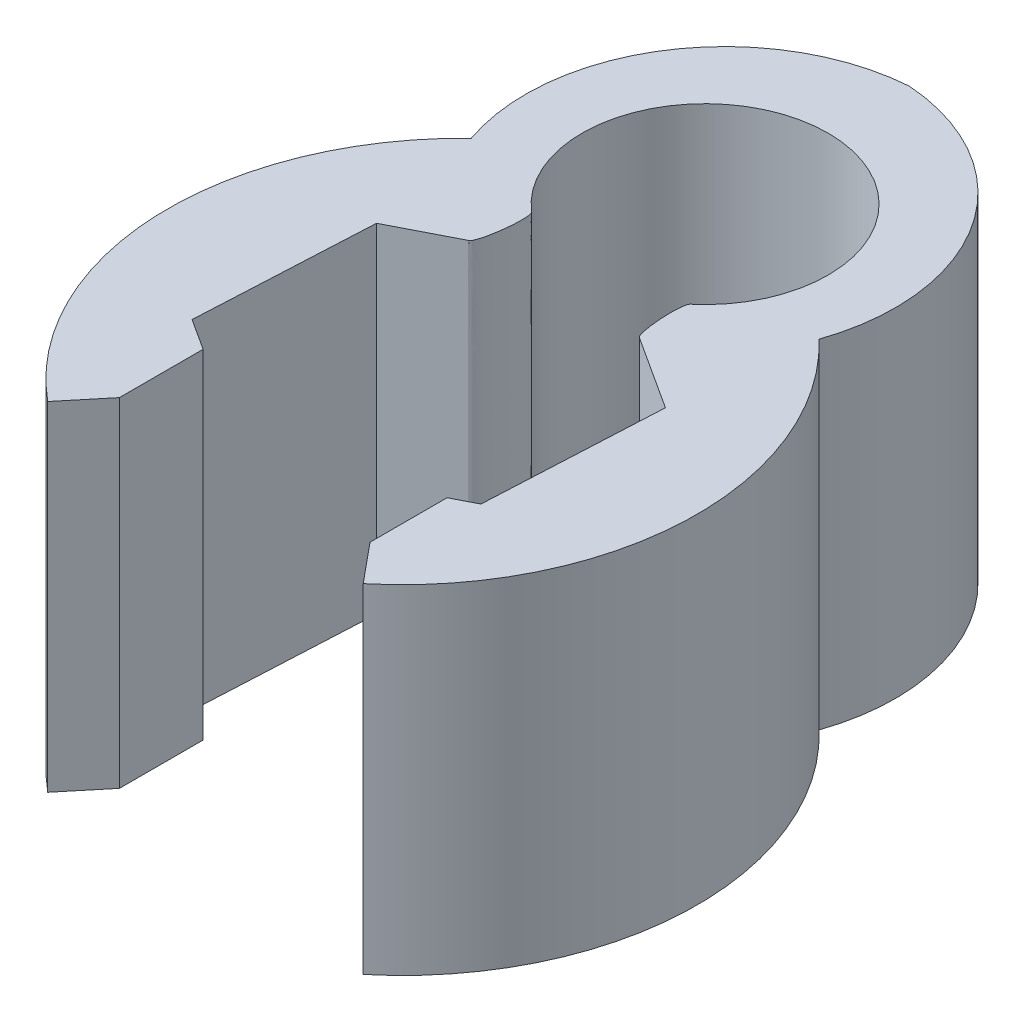
ISO-10303-21;
HEADER;
FILE_DESCRIPTION(('STEP AP214'),'2;1');
FILE_NAME('part.step','',(''),(''),'','','');
FILE_SCHEMA(('AUTOMOTIVE_DESIGN { 1 0 10303 214 1 1 1 1 }'));
ENDSEC;
DATA;
#1=APPLICATION_CONTEXT('core data for automotive mechanical design processes');
#2=APPLICATION_PROTOCOL_DEFINITION('international standard','automotive_design',2000,#1);
#3=PRODUCT_CONTEXT('',#1,'mechanical');
#4=PRODUCT('Part','Part','',(#3));
#5=PRODUCT_RELATED_PRODUCT_CATEGORY('part','',(#4));
#6=PRODUCT_DEFINITION_FORMATION('','',#4);
#7=PRODUCT_DEFINITION_CONTEXT('part definition',#1,'design');
#8=PRODUCT_DEFINITION('design','',#6,#7);
#9=PRODUCT_DEFINITION_SHAPE('','',#8);
#10=(LENGTH_UNIT() NAMED_UNIT(*) SI_UNIT(.MILLI.,.METRE.));
#11=(NAMED_UNIT(*) PLANE_ANGLE_UNIT() SI_UNIT($,.RADIAN.));
#12=(NAMED_UNIT(*) SI_UNIT($,.STERADIAN.) SOLID_ANGLE_UNIT());
#13=UNCERTAINTY_MEASURE_WITH_UNIT(LENGTH_MEASURE(1.E-05),#10,'distance_accuracy_value','');
#14=(GEOMETRIC_REPRESENTATION_CONTEXT(3) GLOBAL_UNCERTAINTY_ASSIGNED_CONTEXT((#13)) GLOBAL_UNIT_ASSIGNED_CONTEXT((#10,
#11,#12)) REPRESENTATION_CONTEXT('',''));
#15=CARTESIAN_POINT('',(0.,0.,0.));
#16=DIRECTION('',(0.,0.,1.));
#17=DIRECTION('',(1.,0.,0.));
#18=AXIS2_PLACEMENT_3D('',#15,#16,#17);
#19=CARTESIAN_POINT('',(-0.598376770378096,12.7,0.494644047014797));
#20=DIRECTION('',(0.770751226655631,0.,-0.637136207265636));
#21=DIRECTION('',(-0.637136207265636,0.,-0.770751226655631));
#22=AXIS2_PLACEMENT_3D('',#19,#20,#21);
#23=PLANE('',#22);
#24=DIRECTION('',(0.637136207265636,0.,0.770751226655631));
#25=VECTOR('',#24,1.);
#26=CARTESIAN_POINT('',(-0.598376770378096,0.,0.494644047014797));
#27=LINE('',#26,#25);
#28=CARTESIAN_POINT('',(4.70120496832042,0.,6.90561093177807));
#29=VERTEX_POINT('',#28);
#30=CARTESIAN_POINT('',(5.9187802535043,0.,8.37852619526394));
#31=VERTEX_POINT('',#30);
#32=EDGE_CURVE('E196',#29,#31,#27,.T.);
#33=ORIENTED_EDGE('',*,*,#32,.T.);
#34=DIRECTION('',(0.,-1.,0.));
#35=VECTOR('',#34,1.);
#36=CARTESIAN_POINT('',(5.9187802535043,12.7,8.37852619526394));
#37=LINE('',#36,#35);
#38=CARTESIAN_POINT('',(5.9187802535043,12.7,8.37852619526394));
#39=VERTEX_POINT('',#38);
#40=EDGE_CURVE('E177',#39,#31,#37,.T.);
#41=ORIENTED_EDGE('',*,*,#40,.F.);
#42=DIRECTION('',(0.637136207265636,0.,0.770751226655631));
#43=VECTOR('',#42,1.);
#44=CARTESIAN_POINT('',(-0.598376770378096,12.7,0.494644047014797));
#45=LINE('',#44,#43);
#46=CARTESIAN_POINT('',(4.70120496832042,12.7,6.90561093177807));
#47=VERTEX_POINT('',#46);
#48=EDGE_CURVE('E183',#47,#39,#45,.T.);
#49=ORIENTED_EDGE('',*,*,#48,.F.);
#50=DIRECTION('',(0.,-1.,0.));
#51=VECTOR('',#50,1.);
#52=CARTESIAN_POINT('',(4.70120496832042,12.7,6.90561093177807));
#53=LINE('',#52,#51);
#54=EDGE_CURVE('E225',#47,#29,#53,.T.);
#55=ORIENTED_EDGE('',*,*,#54,.T.);
#56=EDGE_LOOP('',(#33,#41,#49,#55));
#57=FACE_BOUND('',#56,.T.);
#58=ADVANCED_FACE('F46',(#57),#23,.F.);
#59=CARTESIAN_POINT('',(-1.12456517035275,12.7,-0.141892301269298));
#60=DIRECTION('',(0.,-1.,0.));
#61=DIRECTION('',(0.,0.,-1.));
#62=AXIS2_PLACEMENT_3D('',#59,#60,#61);
#63=CYLINDRICAL_SURFACE('',#62,11.0546933976404);
#64=CARTESIAN_POINT('',(-1.12456517035275,0.,-0.141892301269298));
#65=DIRECTION('',(0.,1.,0.));
#66=DIRECTION('',(0.,0.,1.));
#67=AXIS2_PLACEMENT_3D('',#64,#65,#66);
#68=CIRCLE('',#67,11.0546933976404);
#69=CARTESIAN_POINT('',(6.52662469768185,0.,-8.12096115165017));
#70=VERTEX_POINT('',#69);
#71=EDGE_CURVE('E261',#31,#70,#68,.T.);
#72=ORIENTED_EDGE('',*,*,#71,.T.);
#73=DIRECTION('',(0.,-1.,0.));
#74=VECTOR('',#73,1.);
#75=CARTESIAN_POINT('',(6.52662469768185,12.7,-8.12096115165017));
#76=LINE('',#75,#74);
#77=CARTESIAN_POINT('',(6.52662469768185,12.7,-8.12096115165017));
#78=VERTEX_POINT('',#77);
#79=EDGE_CURVE('E180',#78,#70,#76,.T.);
#80=ORIENTED_EDGE('',*,*,#79,.F.);
#81=CARTESIAN_POINT('',(-1.12456517035275,12.7,-0.141892301269298));
#82=DIRECTION('',(0.,1.,0.));
#83=DIRECTION('',(0.,0.,1.));
#84=AXIS2_PLACEMENT_3D('',#81,#82,#83);
#85=CIRCLE('',#84,11.0546933976404);
#86=EDGE_CURVE('E173',#39,#78,#85,.T.);
#87=ORIENTED_EDGE('',*,*,#86,.F.);
#88=ORIENTED_EDGE('',*,*,#40,.T.);
#89=EDGE_LOOP('',(#72,#80,#87,#88));
#90=FACE_BOUND('',#89,.T.);
#91=ADVANCED_FACE('F175',(#90),#63,.T.);
#92=CARTESIAN_POINT('',(-0.542547571953858,12.7,-10.5725213353697));
#93=DIRECTION('',(0.,-1.,0.));
#94=DIRECTION('',(0.,0.,-1.));
#95=AXIS2_PLACEMENT_3D('',#92,#93,#94);
#96=CYLINDRICAL_SURFACE('',#95,7.48220180910577);
#97=CARTESIAN_POINT('',(-0.542547571953858,0.,-10.5725213353697));
#98=DIRECTION('',(0.,1.,0.));
#99=DIRECTION('',(0.,0.,1.));
#100=AXIS2_PLACEMENT_3D('',#97,#98,#99);
#101=CIRCLE('',#100,7.48220180910577);
#102=CARTESIAN_POINT('',(0.,0.,-18.0350266817231));
#103=VERTEX_POINT('',#102);
#104=EDGE_CURVE('E258',#70,#103,#101,.T.);
#105=ORIENTED_EDGE('',*,*,#104,.T.);
#106=DIRECTION('',(0.,-1.,0.));
#107=VECTOR('',#106,1.);
#108=CARTESIAN_POINT('',(0.,12.7,-18.0350266817231));
#109=LINE('',#108,#107);
#110=CARTESIAN_POINT('',(0.,12.7,-18.0350266817231));
#111=VERTEX_POINT('',#110);
#112=EDGE_CURVE('E201',#111,#103,#109,.T.);
#113=ORIENTED_EDGE('',*,*,#112,.F.);
#114=CARTESIAN_POINT('',(-0.542547571953858,12.7,-10.5725213353697));
#115=DIRECTION('',(0.,1.,0.));
#116=DIRECTION('',(0.,0.,1.));
#117=AXIS2_PLACEMENT_3D('',#114,#115,#116);
#118=CIRCLE('',#117,7.48220180910577);
#119=EDGE_CURVE('E182',#78,#111,#118,.T.);
#120=ORIENTED_EDGE('',*,*,#119,.F.);
#121=ORIENTED_EDGE('',*,*,#79,.T.);
#122=EDGE_LOOP('',(#105,#113,#120,#121));
#123=FACE_BOUND('',#122,.T.);
#124=ADVANCED_FACE('F259',(#123),#96,.T.);
#125=CARTESIAN_POINT('',(0.542547571953858,12.7,-10.5725213353697));
#126=DIRECTION('',(0.,-1.,0.));
#127=DIRECTION('',(0.,0.,-1.));
#128=AXIS2_PLACEMENT_3D('',#125,#126,#127);
#129=CYLINDRICAL_SURFACE('',#128,7.48220180910577);
#130=CARTESIAN_POINT('',(0.542547571953858,0.,-10.5725213353697));
#131=DIRECTION('',(0.,1.,0.));
#132=DIRECTION('',(0.,0.,1.));
#133=AXIS2_PLACEMENT_3D('',#130,#131,#132);
#134=CIRCLE('',#133,7.48220180910577);
#135=CARTESIAN_POINT('',(-6.52662469768186,0.,-8.12096115165017));
#136=VERTEX_POINT('',#135);
#137=EDGE_CURVE('E252',#136,#103,#134,.F.);
#138=ORIENTED_EDGE('',*,*,#137,.F.);
#139=DIRECTION('',(0.,-1.,0.));
#140=VECTOR('',#139,1.);
#141=CARTESIAN_POINT('',(-6.52662469768186,12.7,-8.12096115165017));
#142=LINE('',#141,#140);
#143=CARTESIAN_POINT('',(-6.52662469768186,12.7,-8.12096115165017));
#144=VERTEX_POINT('',#143);
#145=EDGE_CURVE('E244',#144,#136,#142,.T.);
#146=ORIENTED_EDGE('',*,*,#145,.F.);
#147=CARTESIAN_POINT('',(0.542547571953858,12.7,-10.5725213353697));
#148=DIRECTION('',(0.,1.,0.));
#149=DIRECTION('',(0.,0.,1.));
#150=AXIS2_PLACEMENT_3D('',#147,#148,#149);
#151=CIRCLE('',#150,7.48220180910577);
#152=EDGE_CURVE('E255',#144,#111,#151,.F.);
#153=ORIENTED_EDGE('',*,*,#152,.T.);
#154=ORIENTED_EDGE('',*,*,#112,.T.);
#155=EDGE_LOOP('',(#138,#146,#153,#154));
#156=FACE_BOUND('',#155,.T.);
#157=ADVANCED_FACE('F250',(#156),#129,.T.);
#158=CARTESIAN_POINT('',(1.12456517035275,12.7,-0.141892301269298));
#159=DIRECTION('',(0.,-1.,0.));
#160=DIRECTION('',(0.,0.,-1.));
#161=AXIS2_PLACEMENT_3D('',#158,#159,#160);
#162=CYLINDRICAL_SURFACE('',#161,11.0546933976404);
#163=CARTESIAN_POINT('',(1.12456517035275,0.,-0.141892301269298));
#164=DIRECTION('',(0.,1.,0.));
#165=DIRECTION('',(0.,0.,1.));
#166=AXIS2_PLACEMENT_3D('',#163,#164,#165);
#167=CIRCLE('',#166,11.0546933976404);
#168=CARTESIAN_POINT('',(-5.91878025350429,0.,8.37852619526395));
#169=VERTEX_POINT('',#168);
#170=EDGE_CURVE('E266',#169,#136,#167,.F.);
#171=ORIENTED_EDGE('',*,*,#170,.F.);
#172=DIRECTION('',(0.,-1.,0.));
#173=VECTOR('',#172,1.);
#174=CARTESIAN_POINT('',(-5.91878025350429,12.7,8.37852619526395));
#175=LINE('',#174,#173);
#176=CARTESIAN_POINT('',(-5.91878025350429,12.7,8.37852619526395));
#177=VERTEX_POINT('',#176);
#178=EDGE_CURVE('E242',#177,#169,#175,.T.);
#179=ORIENTED_EDGE('',*,*,#178,.F.);
#180=CARTESIAN_POINT('',(1.12456517035275,12.7,-0.141892301269298));
#181=DIRECTION('',(0.,1.,0.));
#182=DIRECTION('',(0.,0.,1.));
#183=AXIS2_PLACEMENT_3D('',#180,#181,#182);
#184=CIRCLE('',#183,11.0546933976404);
#185=EDGE_CURVE('E546',#177,#144,#184,.F.);
#186=ORIENTED_EDGE('',*,*,#185,.T.);
#187=ORIENTED_EDGE('',*,*,#145,.T.);
#188=EDGE_LOOP('',(#171,#179,#186,#187));
#189=FACE_BOUND('',#188,.T.);
#190=ADVANCED_FACE('F507',(#189),#162,.T.);
#191=CARTESIAN_POINT('',(0.598376770378092,12.7,0.494644047014792));
#192=DIRECTION('',(0.770751226655632,0.,0.637136207265635));
#193=DIRECTION('',(0.637136207265635,0.,-0.770751226655632));
#194=AXIS2_PLACEMENT_3D('',#191,#192,#193);
#195=PLANE('',#194);
#196=DIRECTION('',(-0.637136207265635,0.,0.770751226655632));
#197=VECTOR('',#196,1.);
#198=CARTESIAN_POINT('',(0.598376770378092,0.,0.494644047014792));
#199=LINE('',#198,#197);
#200=CARTESIAN_POINT('',(-4.70120496832041,0.,6.90561093177807));
#201=VERTEX_POINT('',#200);
#202=EDGE_CURVE('E268',#201,#169,#199,.T.);
#203=ORIENTED_EDGE('',*,*,#202,.F.);
#204=DIRECTION('',(0.,-1.,0.));
#205=VECTOR('',#204,1.);
#206=CARTESIAN_POINT('',(-4.70120496832041,12.7,6.90561093177807));
#207=LINE('',#206,#205);
#208=CARTESIAN_POINT('',(-4.70120496832041,12.7,6.90561093177807));
#209=VERTEX_POINT('',#208);
#210=EDGE_CURVE('E240',#209,#201,#207,.T.);
#211=ORIENTED_EDGE('',*,*,#210,.F.);
#212=DIRECTION('',(-0.637136207265635,0.,0.770751226655632));
#213=VECTOR('',#212,1.);
#214=CARTESIAN_POINT('',(0.598376770378092,12.7,0.494644047014792));
#215=LINE('',#214,#213);
#216=EDGE_CURVE('E543',#209,#177,#215,.T.);
#217=ORIENTED_EDGE('',*,*,#216,.T.);
#218=ORIENTED_EDGE('',*,*,#178,.T.);
#219=EDGE_LOOP('',(#203,#211,#217,#218));
#220=FACE_BOUND('',#219,.T.);
#221=ADVANCED_FACE('F510',(#220),#195,.T.);
#222=CARTESIAN_POINT('',(-4.70120496832042,12.7,0.));
#223=DIRECTION('',(1.,0.,0.));
#224=DIRECTION('',(0.,0.,-1.));
#225=AXIS2_PLACEMENT_3D('',#222,#223,#224);
#226=PLANE('',#225);
#227=DIRECTION('',(0.,0.,1.));
#228=VECTOR('',#227,1.);
#229=CARTESIAN_POINT('',(-4.70120496832042,0.,0.));
#230=LINE('',#229,#228);
#231=CARTESIAN_POINT('',(-4.70120496832042,0.,3.76579802688678));
#232=VERTEX_POINT('',#231);
#233=EDGE_CURVE('E273',#232,#201,#230,.T.);
#234=ORIENTED_EDGE('',*,*,#233,.F.);
#235=DIRECTION('',(0.,-1.,0.));
#236=VECTOR('',#235,1.);
#237=CARTESIAN_POINT('',(-4.70120496832042,12.7,3.76579802688678));
#238=LINE('',#237,#236);
#239=CARTESIAN_POINT('',(-4.70120496832042,12.7,3.76579802688678));
#240=VERTEX_POINT('',#239);
#241=EDGE_CURVE('E238',#240,#232,#238,.T.);
#242=ORIENTED_EDGE('',*,*,#241,.F.);
#243=DIRECTION('',(0.,0.,1.));
#244=VECTOR('',#243,1.);
#245=CARTESIAN_POINT('',(-4.70120496832042,12.7,0.));
#246=LINE('',#245,#244);
#247=EDGE_CURVE('E538',#240,#209,#246,.T.);
#248=ORIENTED_EDGE('',*,*,#247,.T.);
#249=ORIENTED_EDGE('',*,*,#210,.T.);
#250=EDGE_LOOP('',(#234,#242,#248,#249));
#251=FACE_BOUND('',#250,.T.);
#252=ADVANCED_FACE('F514',(#251),#226,.T.);
#253=CARTESIAN_POINT('',(-3.10319954031292,12.7,4.7991017506406));
#254=DIRECTION('',(0.542992045549067,0.,-0.839737839132214));
#255=DIRECTION('',(-0.839737839132214,0.,-0.542992045549067));
#256=AXIS2_PLACEMENT_3D('',#253,#254,#255);
#257=PLANE('',#256);
#258=DIRECTION('',(0.839737839132214,0.,0.542992045549067));
#259=VECTOR('',#258,1.);
#260=CARTESIAN_POINT('',(-3.10319954031292,0.,4.7991017506406));
#261=LINE('',#260,#259);
#262=CARTESIAN_POINT('',(-5.87396222791367,0.,3.00746866069182));
#263=VERTEX_POINT('',#262);
#264=EDGE_CURVE('E276',#263,#232,#261,.T.);
#265=ORIENTED_EDGE('',*,*,#264,.F.);
#266=DIRECTION('',(0.,-1.,0.));
#267=VECTOR('',#266,1.);
#268=CARTESIAN_POINT('',(-5.87396222791367,12.7,3.00746866069182));
#269=LINE('',#268,#267);
#270=CARTESIAN_POINT('',(-5.87396222791367,12.7,3.00746866069182));
#271=VERTEX_POINT('',#270);
#272=EDGE_CURVE('E236',#271,#263,#269,.T.);
#273=ORIENTED_EDGE('',*,*,#272,.F.);
#274=DIRECTION('',(0.839737839132214,0.,0.542992045549067));
#275=VECTOR('',#274,1.);
#276=CARTESIAN_POINT('',(-3.10319954031292,12.7,4.7991017506406));
#277=LINE('',#276,#275);
#278=EDGE_CURVE('E537',#271,#240,#277,.T.);
#279=ORIENTED_EDGE('',*,*,#278,.T.);
#280=ORIENTED_EDGE('',*,*,#241,.T.);
#281=EDGE_LOOP('',(#265,#273,#279,#280));
#282=FACE_BOUND('',#281,.T.);
#283=ADVANCED_FACE('F518',(#282),#257,.T.);
#284=CARTESIAN_POINT('',(-5.70774380155759,12.7,-0.287898759602873));
#285=DIRECTION('',(0.998730323982081,0.,0.0503759859322613));
#286=DIRECTION('',(0.0503759859322613,0.,-0.998730323982081));
#287=AXIS2_PLACEMENT_3D('',#284,#285,#286);
#288=PLANE('',#287);
#289=DIRECTION('',(-0.0503759859322613,0.,0.998730323982081));
#290=VECTOR('',#289,1.);
#291=CARTESIAN_POINT('',(-5.70774380155759,0.,-0.287898759602873));
#292=LINE('',#291,#290);
#293=CARTESIAN_POINT('',(-5.54152537520151,0.,-3.58326617989757));
#294=VERTEX_POINT('',#293);
#295=EDGE_CURVE('E279',#294,#263,#292,.T.);
#296=ORIENTED_EDGE('',*,*,#295,.F.);
#297=DIRECTION('',(0.,-1.,0.));
#298=VECTOR('',#297,1.);
#299=CARTESIAN_POINT('',(-5.54152537520151,12.7,-3.58326617989757));
#300=LINE('',#299,#298);
#301=CARTESIAN_POINT('',(-5.54152537520151,12.7,-3.58326617989757));
#302=VERTEX_POINT('',#301);
#303=EDGE_CURVE('E233',#302,#294,#300,.T.);
#304=ORIENTED_EDGE('',*,*,#303,.F.);
#305=DIRECTION('',(-0.0503759859322613,0.,0.998730323982081));
#306=VECTOR('',#305,1.);
#307=CARTESIAN_POINT('',(-5.70774380155759,12.7,-0.287898759602873));
#308=LINE('',#307,#306);
#309=EDGE_CURVE('E388',#302,#271,#308,.T.);
#310=ORIENTED_EDGE('',*,*,#309,.T.);
#311=ORIENTED_EDGE('',*,*,#272,.T.);
#312=EDGE_LOOP('',(#296,#304,#310,#311));
#313=FACE_BOUND('',#312,.T.);
#314=ADVANCED_FACE('F521',(#313),#288,.T.);
#315=CARTESIAN_POINT('',(-2.60454426124468,12.7,-5.08700051024348));
#316=DIRECTION('',(0.455738278433015,0.,0.890113825064476));
#317=DIRECTION('',(0.890113825064476,0.,-0.455738278433015));
#318=AXIS2_PLACEMENT_3D('',#315,#316,#317);
#319=PLANE('',#318);
#320=DIRECTION('',(-0.890113825064476,0.,0.455738278433015));
#321=VECTOR('',#320,1.);
#322=CARTESIAN_POINT('',(-2.60454426124468,0.,-5.08700051024348));
#323=LINE('',#322,#321);
#324=CARTESIAN_POINT('',(-3.24270927997033,0.,-4.76026002065594));
#325=VERTEX_POINT('',#324);
#326=EDGE_CURVE('E281',#325,#294,#323,.T.);
#327=ORIENTED_EDGE('',*,*,#326,.F.);
#328=CARTESIAN_POINT('',(-3.24270927997033,13.335,-4.76026002065594));
#329=CARTESIAN_POINT('',(-3.24270927997033,8.67833333333333,-4.76026002065594));
#330=CARTESIAN_POINT('',(-3.24270927997033,4.02166666666667,-4.76026002065594));
#331=CARTESIAN_POINT('',(-3.24270927997033,-0.634999999999998,-4.76026002065594));
#332=(BOUNDED_CURVE() B_SPLINE_CURVE(3,(#328,#329,#330,#331),.UNSPECIFIED.,.F.,
.F.) B_SPLINE_CURVE_WITH_KNOTS((4,4),(-0.000635,0.013335),
.UNSPECIFIED.) CURVE() GEOMETRIC_REPRESENTATION_ITEM() RATIONAL_B_SPLINE_CURVE((1.,1.,1.,1.)) REPRESENTATION_ITEM(''));
#333=CARTESIAN_POINT('',(-3.24270927997033,12.7,-4.76026002065594));
#334=VERTEX_POINT('',#333);
#335=EDGE_CURVE('E12',#325,#334,#332,.F.);
#336=ORIENTED_EDGE('',*,*,#335,.T.);
#337=DIRECTION('',(-0.890113825064476,0.,0.455738278433015));
#338=VECTOR('',#337,1.);
#339=CARTESIAN_POINT('',(-2.60454426124468,12.7,-5.08700051024348));
#340=LINE('',#339,#338);
#341=EDGE_CURVE('E319',#334,#302,#340,.T.);
#342=ORIENTED_EDGE('',*,*,#341,.T.);
#343=ORIENTED_EDGE('',*,*,#303,.T.);
#344=EDGE_LOOP('',(#327,#336,#342,#343));
#345=FACE_BOUND('',#344,.T.);
#346=ADVANCED_FACE('F371',(#345),#319,.T.);
#347=CARTESIAN_POINT('',(0.,12.7,-10.3692276538807));
#348=DIRECTION('',(0.,-1.,0.));
#349=DIRECTION('',(0.,0.,-1.));
#350=AXIS2_PLACEMENT_3D('',#347,#348,#349);
#351=CYLINDRICAL_SURFACE('',#350,4.61735997238747);
#352=CARTESIAN_POINT('',(0.,0.,-10.3692276538807));
#353=DIRECTION('',(0.,1.,0.));
#354=DIRECTION('',(0.,0.,1.));
#355=AXIS2_PLACEMENT_3D('',#352,#353,#354);
#356=CIRCLE('',#355,4.61735997238747);
#357=CARTESIAN_POINT('',(2.97420564902517,0.,-6.83735649656018));
#358=VERTEX_POINT('',#357);
#359=CARTESIAN_POINT('',(-2.99713740518316,0.,-6.85679537851113));
#360=VERTEX_POINT('',#359);
#361=EDGE_CURVE('E210',#358,#360,#356,.T.);
#362=ORIENTED_EDGE('',*,*,#361,.F.);
#363=CARTESIAN_POINT('',(2.97420564902517,13.335,-6.83735649656018));
#364=CARTESIAN_POINT('',(2.97420564902517,8.67833333333333,-6.83735649656018));
#365=CARTESIAN_POINT('',(2.97420564902517,4.02166666666667,-6.83735649656018));
#366=CARTESIAN_POINT('',(2.97420564902517,-0.634999999999998,-6.83735649656018));
#367=(BOUNDED_CURVE() B_SPLINE_CURVE(3,(#363,#364,#365,#366),.UNSPECIFIED.,.F.,
.F.) B_SPLINE_CURVE_WITH_KNOTS((4,4),(-0.000635,0.013335),
.UNSPECIFIED.) CURVE() GEOMETRIC_REPRESENTATION_ITEM() RATIONAL_B_SPLINE_CURVE((1.,1.,1.,1.)) REPRESENTATION_ITEM(''));
#368=CARTESIAN_POINT('',(2.97420564902517,12.7,-6.83735649656018));
#369=VERTEX_POINT('',#368);
#370=EDGE_CURVE('E455',#358,#369,#367,.F.);
#371=ORIENTED_EDGE('',*,*,#370,.T.);
#372=CARTESIAN_POINT('',(0.,12.7,-10.3692276538807));
#373=DIRECTION('',(0.,1.,0.));
#374=DIRECTION('',(0.,0.,1.));
#375=AXIS2_PLACEMENT_3D('',#372,#373,#374);
#376=CIRCLE('',#375,4.61735997238747);
#377=CARTESIAN_POINT('',(-2.99713740518315,12.7,-6.85679537851113));
#378=VERTEX_POINT('',#377);
#379=EDGE_CURVE('E311',#369,#378,#376,.T.);
#380=ORIENTED_EDGE('',*,*,#379,.T.);
#381=CARTESIAN_POINT('',(-2.99713740518315,-0.634999999999998,-6.85679537851113));
#382=CARTESIAN_POINT('',(-2.99713740518315,4.02166666666667,-6.85679537851113));
#383=CARTESIAN_POINT('',(-2.99713740518315,8.67833333333333,-6.85679537851113));
#384=CARTESIAN_POINT('',(-2.99713740518315,13.335,-6.85679537851113));
#385=(BOUNDED_CURVE() B_SPLINE_CURVE(3,(#381,#382,#383,#384),.UNSPECIFIED.,.F.,
.F.) B_SPLINE_CURVE_WITH_KNOTS((4,4),(-0.000635,0.013335),
.UNSPECIFIED.) CURVE() GEOMETRIC_REPRESENTATION_ITEM() RATIONAL_B_SPLINE_CURVE((1.,1.,1.,1.)) REPRESENTATION_ITEM(''));
#386=EDGE_CURVE('E476',#378,#360,#385,.F.);
#387=ORIENTED_EDGE('',*,*,#386,.T.);
#388=EDGE_LOOP('',(#362,#371,#380,#387));
#389=FACE_BOUND('',#388,.T.);
#390=ADVANCED_FACE('F367',(#389),#351,.F.);
#391=CARTESIAN_POINT('',(3.10319954031291,12.7,-4.79910175064061));
#392=DIRECTION('',(-0.542992045549066,0.,0.839737839132214));
#393=DIRECTION('',(0.839737839132214,0.,0.542992045549066));
#394=AXIS2_PLACEMENT_3D('',#391,#392,#393);
#395=PLANE('',#394);
#396=DIRECTION('',(-0.839737839132214,0.,-0.542992045549066));
#397=VECTOR('',#396,1.);
#398=CARTESIAN_POINT('',(3.10319954031291,12.7,-4.79910175064061));
#399=LINE('',#398,#397);
#400=CARTESIAN_POINT('',(5.87396222791367,12.7,-3.00746866069182));
#401=VERTEX_POINT('',#400);
#402=CARTESIAN_POINT('',(3.10265788418253,12.7,-4.79945199682044));
#403=VERTEX_POINT('',#402);
#404=EDGE_CURVE('E211',#401,#403,#399,.T.);
#405=ORIENTED_EDGE('',*,*,#404,.T.);
#406=CARTESIAN_POINT('',(3.10265788418253,-0.634999999999998,-4.79945199682044));
#407=CARTESIAN_POINT('',(3.10265788418253,4.02166666666667,-4.79945199682044));
#408=CARTESIAN_POINT('',(3.10265788418253,8.67833333333333,-4.79945199682044));
#409=CARTESIAN_POINT('',(3.10265788418253,13.335,-4.79945199682044));
#410=(BOUNDED_CURVE() B_SPLINE_CURVE(3,(#406,#407,#408,#409),.UNSPECIFIED.,.F.,
.F.) B_SPLINE_CURVE_WITH_KNOTS((4,4),(-0.000635,0.013335),
.UNSPECIFIED.) CURVE() GEOMETRIC_REPRESENTATION_ITEM() RATIONAL_B_SPLINE_CURVE((1.,1.,1.,1.)) REPRESENTATION_ITEM(''));
#411=CARTESIAN_POINT('',(3.10265788418253,0.,-4.79945199682044));
#412=VERTEX_POINT('',#411);
#413=EDGE_CURVE('E197',#403,#412,#410,.F.);
#414=ORIENTED_EDGE('',*,*,#413,.T.);
#415=DIRECTION('',(-0.839737839132214,0.,-0.542992045549066));
#416=VECTOR('',#415,1.);
#417=CARTESIAN_POINT('',(3.10319954031291,0.,-4.79910175064061));
#418=LINE('',#417,#416);
#419=CARTESIAN_POINT('',(5.87396222791367,0.,-3.00746866069182));
#420=VERTEX_POINT('',#419);
#421=EDGE_CURVE('E205',#420,#412,#418,.T.);
#422=ORIENTED_EDGE('',*,*,#421,.F.);
#423=DIRECTION('',(0.,-1.,0.));
#424=VECTOR('',#423,1.);
#425=CARTESIAN_POINT('',(5.87396222791367,12.7,-3.00746866069182));
#426=LINE('',#425,#424);
#427=EDGE_CURVE('E231',#401,#420,#426,.T.);
#428=ORIENTED_EDGE('',*,*,#427,.F.);
#429=EDGE_LOOP('',(#405,#414,#422,#428));
#430=FACE_BOUND('',#429,.T.);
#431=ADVANCED_FACE('F349',(#430),#395,.T.);
#432=CARTESIAN_POINT('',(5.70774380155759,12.7,0.287898759602873));
#433=DIRECTION('',(-0.998730323982081,0.,-0.0503759859322612));
#434=DIRECTION('',(-0.0503759859322612,0.,0.998730323982081));
#435=AXIS2_PLACEMENT_3D('',#432,#433,#434);
#436=PLANE('',#435);
#437=DIRECTION('',(0.0503759859322612,0.,-0.998730323982081));
#438=VECTOR('',#437,1.);
#439=CARTESIAN_POINT('',(5.70774380155759,0.,0.287898759602873));
#440=LINE('',#439,#438);
#441=CARTESIAN_POINT('',(5.54152537520151,0.,3.58326617989757));
#442=VERTEX_POINT('',#441);
#443=EDGE_CURVE('E209',#442,#420,#440,.T.);
#444=ORIENTED_EDGE('',*,*,#443,.F.);
#445=DIRECTION('',(0.,-1.,0.));
#446=VECTOR('',#445,1.);
#447=CARTESIAN_POINT('',(5.54152537520151,12.7,3.58326617989757));
#448=LINE('',#447,#446);
#449=CARTESIAN_POINT('',(5.54152537520151,12.7,3.58326617989757));
#450=VERTEX_POINT('',#449);
#451=EDGE_CURVE('E229',#450,#442,#448,.T.);
#452=ORIENTED_EDGE('',*,*,#451,.F.);
#453=DIRECTION('',(0.0503759859322612,0.,-0.998730323982081));
#454=VECTOR('',#453,1.);
#455=CARTESIAN_POINT('',(5.70774380155759,12.7,0.287898759602873));
#456=LINE('',#455,#454);
#457=EDGE_CURVE('E328',#450,#401,#456,.T.);
#458=ORIENTED_EDGE('',*,*,#457,.T.);
#459=ORIENTED_EDGE('',*,*,#427,.T.);
#460=EDGE_LOOP('',(#444,#452,#458,#459));
#461=FACE_BOUND('',#460,.T.);
#462=ADVANCED_FACE('F343',(#461),#436,.T.);
#463=CARTESIAN_POINT('',(2.60454426124468,12.7,5.08700051024348));
#464=DIRECTION('',(-0.455738278433015,0.,-0.890113825064475));
#465=DIRECTION('',(-0.890113825064476,0.,0.455738278433015));
#466=AXIS2_PLACEMENT_3D('',#463,#464,#465);
#467=PLANE('',#466);
#468=DIRECTION('',(0.890113825064476,0.,-0.455738278433015));
#469=VECTOR('',#468,1.);
#470=CARTESIAN_POINT('',(2.60454426124468,0.,5.08700051024348));
#471=LINE('',#470,#469);
#472=CARTESIAN_POINT('',(4.70120496832042,0.,4.01351022822069));
#473=VERTEX_POINT('',#472);
#474=EDGE_CURVE('E221',#473,#442,#471,.T.);
#475=ORIENTED_EDGE('',*,*,#474,.F.);
#476=DIRECTION('',(0.,-1.,0.));
#477=VECTOR('',#476,1.);
#478=CARTESIAN_POINT('',(4.70120496832042,12.7,4.01351022822069));
#479=LINE('',#478,#477);
#480=CARTESIAN_POINT('',(4.70120496832042,12.7,4.01351022822069));
#481=VERTEX_POINT('',#480);
#482=EDGE_CURVE('E227',#481,#473,#479,.T.);
#483=ORIENTED_EDGE('',*,*,#482,.F.);
#484=DIRECTION('',(0.890113825064476,0.,-0.455738278433015));
#485=VECTOR('',#484,1.);
#486=CARTESIAN_POINT('',(2.60454426124468,12.7,5.08700051024348));
#487=LINE('',#486,#485);
#488=EDGE_CURVE('E331',#481,#450,#487,.T.);
#489=ORIENTED_EDGE('',*,*,#488,.T.);
#490=ORIENTED_EDGE('',*,*,#451,.T.);
#491=EDGE_LOOP('',(#475,#483,#489,#490));
#492=FACE_BOUND('',#491,.T.);
#493=ADVANCED_FACE('F339',(#492),#467,.T.);
#494=CARTESIAN_POINT('',(4.70120496832042,12.7,0.));
#495=DIRECTION('',(1.,0.,0.));
#496=DIRECTION('',(0.,0.,-1.));
#497=AXIS2_PLACEMENT_3D('',#494,#495,#496);
#498=PLANE('',#497);
#499=DIRECTION('',(0.,0.,1.));
#500=VECTOR('',#499,1.);
#501=CARTESIAN_POINT('',(4.70120496832042,0.,0.));
#502=LINE('',#501,#500);
#503=EDGE_CURVE('E193',#473,#29,#502,.T.);
#504=ORIENTED_EDGE('',*,*,#503,.T.);
#505=ORIENTED_EDGE('',*,*,#54,.F.);
#506=DIRECTION('',(0.,0.,1.));
#507=VECTOR('',#506,1.);
#508=CARTESIAN_POINT('',(4.70120496832042,12.7,0.));
#509=LINE('',#508,#507);
#510=EDGE_CURVE('E189',#481,#47,#509,.T.);
#511=ORIENTED_EDGE('',*,*,#510,.F.);
#512=ORIENTED_EDGE('',*,*,#482,.T.);
#513=EDGE_LOOP('',(#504,#505,#511,#512));
#514=FACE_BOUND('',#513,.T.);
#515=ADVANCED_FACE('F305',(#514),#498,.F.);
#516=CARTESIAN_POINT('',(0.,12.7,0.));
#517=DIRECTION('',(0.,1.,0.));
#518=DIRECTION('',(0.,0.,1.));
#519=AXIS2_PLACEMENT_3D('',#516,#517,#518);
#520=PLANE('',#519);
#521=ORIENTED_EDGE('',*,*,#379,.F.);
#522=CARTESIAN_POINT('',(3.10265788418253,12.7,-4.79945199682044));
#523=CARTESIAN_POINT('',(1.66110640734555,12.7,-5.73158932432362));
#524=CARTESIAN_POINT('',(2.97420564902517,12.7,-6.83735649656017));
#525=(BOUNDED_CURVE() B_SPLINE_CURVE(2,(#522,#523,#524),.UNSPECIFIED.,.F.,
.F.) B_SPLINE_CURVE_WITH_KNOTS((3,3),(0.,1.),
.UNSPECIFIED.) CURVE() GEOMETRIC_REPRESENTATION_ITEM() RATIONAL_B_SPLINE_CURVE((1.,
0.118948345896042,1.)) REPRESENTATION_ITEM(''));
#526=EDGE_CURVE('E60',#369,#403,#525,.F.);
#527=ORIENTED_EDGE('',*,*,#526,.T.);
#528=ORIENTED_EDGE('',*,*,#404,.F.);
#529=ORIENTED_EDGE('',*,*,#457,.F.);
#530=ORIENTED_EDGE('',*,*,#488,.F.);
#531=ORIENTED_EDGE('',*,*,#510,.T.);
#532=ORIENTED_EDGE('',*,*,#48,.T.);
#533=ORIENTED_EDGE('',*,*,#86,.T.);
#534=ORIENTED_EDGE('',*,*,#119,.T.);
#535=ORIENTED_EDGE('',*,*,#152,.F.);
#536=ORIENTED_EDGE('',*,*,#185,.F.);
#537=ORIENTED_EDGE('',*,*,#216,.F.);
#538=ORIENTED_EDGE('',*,*,#247,.F.);
#539=ORIENTED_EDGE('',*,*,#278,.F.);
#540=ORIENTED_EDGE('',*,*,#309,.F.);
#541=ORIENTED_EDGE('',*,*,#341,.F.);
#542=CARTESIAN_POINT('',(-2.99713740518315,12.7,-6.85679537851113));
#543=CARTESIAN_POINT('',(-1.55363692098566,12.7,-5.6250650684561));
#544=CARTESIAN_POINT('',(-3.24270927997033,12.7,-4.76026002065594));
#545=(BOUNDED_CURVE() B_SPLINE_CURVE(2,(#542,#543,#544),.UNSPECIFIED.,.F.,
.F.) B_SPLINE_CURVE_WITH_KNOTS((3,3),(0.,1.),
.UNSPECIFIED.) CURVE() GEOMETRIC_REPRESENTATION_ITEM() RATIONAL_B_SPLINE_CURVE((1.,
0.111239360045646,1.)) REPRESENTATION_ITEM(''));
#546=EDGE_CURVE('E73',#334,#378,#545,.F.);
#547=ORIENTED_EDGE('',*,*,#546,.T.);
#548=EDGE_LOOP('',(#521,#527,#528,#529,#530,#531,#532,#533,#534,#535,#536,#537,#538,#539,#540,
#541,#547));
#549=FACE_BOUND('',#548,.T.);
#550=ADVANCED_FACE('F186',(#549),#520,.T.);
#551=CARTESIAN_POINT('',(0.,0.,0.));
#552=DIRECTION('',(0.,1.,0.));
#553=DIRECTION('',(0.,0.,1.));
#554=AXIS2_PLACEMENT_3D('',#551,#552,#553);
#555=PLANE('',#554);
#556=ORIENTED_EDGE('',*,*,#421,.T.);
#557=CARTESIAN_POINT('',(2.97420564902517,0.,-6.83735649656018));
#558=CARTESIAN_POINT('',(1.66110640734555,0.,-5.73158932432362));
#559=CARTESIAN_POINT('',(3.10265788418253,0.,-4.79945199682044));
#560=(BOUNDED_CURVE() B_SPLINE_CURVE(2,(#557,#558,#559),.UNSPECIFIED.,.F.,
.F.) B_SPLINE_CURVE_WITH_KNOTS((3,3),(0.,1.),
.UNSPECIFIED.) CURVE() GEOMETRIC_REPRESENTATION_ITEM() RATIONAL_B_SPLINE_CURVE((1.,
0.118948345896042,1.)) REPRESENTATION_ITEM(''));
#561=EDGE_CURVE('E345',#412,#358,#560,.F.);
#562=ORIENTED_EDGE('',*,*,#561,.T.);
#563=ORIENTED_EDGE('',*,*,#361,.T.);
#564=CARTESIAN_POINT('',(-3.24270927997033,0.,-4.76026002065594));
#565=CARTESIAN_POINT('',(-1.55363692098566,0.,-5.6250650684561));
#566=CARTESIAN_POINT('',(-2.99713740518315,0.,-6.85679537851113));
#567=(BOUNDED_CURVE() B_SPLINE_CURVE(2,(#564,#565,#566),.UNSPECIFIED.,.F.,
.F.) B_SPLINE_CURVE_WITH_KNOTS((3,3),(0.,1.),
.UNSPECIFIED.) CURVE() GEOMETRIC_REPRESENTATION_ITEM() RATIONAL_B_SPLINE_CURVE((1.,
0.111239360045646,1.)) REPRESENTATION_ITEM(''));
#568=EDGE_CURVE('E200',#360,#325,#567,.F.);
#569=ORIENTED_EDGE('',*,*,#568,.T.);
#570=ORIENTED_EDGE('',*,*,#326,.T.);
#571=ORIENTED_EDGE('',*,*,#295,.T.);
#572=ORIENTED_EDGE('',*,*,#264,.T.);
#573=ORIENTED_EDGE('',*,*,#233,.T.);
#574=ORIENTED_EDGE('',*,*,#202,.T.);
#575=ORIENTED_EDGE('',*,*,#170,.T.);
#576=ORIENTED_EDGE('',*,*,#137,.T.);
#577=ORIENTED_EDGE('',*,*,#104,.F.);
#578=ORIENTED_EDGE('',*,*,#71,.F.);
#579=ORIENTED_EDGE('',*,*,#32,.F.);
#580=ORIENTED_EDGE('',*,*,#503,.F.);
#581=ORIENTED_EDGE('',*,*,#474,.T.);
#582=ORIENTED_EDGE('',*,*,#443,.T.);
#583=EDGE_LOOP('',(#556,#562,#563,#569,#570,#571,#572,#573,#574,#575,#576,#577,#578,#579,#580,
#581,#582));
#584=FACE_BOUND('',#583,.T.);
#585=ADVANCED_FACE('F263',(#584),#555,.F.);
#586=CARTESIAN_POINT('',(3.10265788418253,13.335,-4.79945199682044));
#587=CARTESIAN_POINT('',(3.10265788418253,8.67833333333333,-4.79945199682044));
#588=CARTESIAN_POINT('',(3.10265788418253,4.02166666666667,-4.79945199682044));
#589=CARTESIAN_POINT('',(3.10265788418253,-0.634999999999998,-4.79945199682044));
#590=CARTESIAN_POINT('',(1.66110640734555,13.335,-5.73158932432362));
#591=CARTESIAN_POINT('',(1.66110640734555,8.67833333333333,-5.73158932432362));
#592=CARTESIAN_POINT('',(1.66110640734555,4.02166666666667,-5.73158932432362));
#593=CARTESIAN_POINT('',(1.66110640734555,-0.634999999999998,-5.73158932432362));
#594=CARTESIAN_POINT('',(2.97420564902517,13.335,-6.83735649656018));
#595=CARTESIAN_POINT('',(2.97420564902517,8.67833333333333,-6.83735649656018));
#596=CARTESIAN_POINT('',(2.97420564902517,4.02166666666667,-6.83735649656018));
#597=CARTESIAN_POINT('',(2.97420564902517,-0.634999999999998,-6.83735649656018));
#598=(BOUNDED_SURFACE() B_SPLINE_SURFACE(2,3,((#586,#587,#588,#589),(#590,#591,#592,#593),(#594,
#595,#596,#597)),.UNSPECIFIED.,.F.,.F.,.F.) B_SPLINE_SURFACE_WITH_KNOTS((3,3),(4,4),(0.,1.),
(-0.000635,0.013335),
.UNSPECIFIED.) GEOMETRIC_REPRESENTATION_ITEM() RATIONAL_B_SPLINE_SURFACE(((1.,1.,1.,1.),
(0.118948345896042,0.118948345896042,0.118948345896042,0.118948345896042),(1.,1.,1.,1.))) REPRESENTATION_ITEM('') SURFACE());
#599=ORIENTED_EDGE('',*,*,#526,.F.);
#600=ORIENTED_EDGE('',*,*,#370,.F.);
#601=ORIENTED_EDGE('',*,*,#561,.F.);
#602=ORIENTED_EDGE('',*,*,#413,.F.);
#603=EDGE_LOOP('',(#599,#600,#601,#602));
#604=FACE_BOUND('',#603,.T.);
#605=ADVANCED_FACE('F303',(#604),#598,.T.);
#606=CARTESIAN_POINT('',(-2.99713740518315,13.335,-6.85679537851113));
#607=CARTESIAN_POINT('',(-2.99713740518315,8.67833333333333,-6.85679537851113));
#608=CARTESIAN_POINT('',(-2.99713740518315,4.02166666666667,-6.85679537851113));
#609=CARTESIAN_POINT('',(-2.99713740518315,-0.634999999999998,-6.85679537851113));
#610=CARTESIAN_POINT('',(-1.55363692098566,13.335,-5.6250650684561));
#611=CARTESIAN_POINT('',(-1.55363692098566,8.67833333333333,-5.6250650684561));
#612=CARTESIAN_POINT('',(-1.55363692098566,4.02166666666667,-5.6250650684561));
#613=CARTESIAN_POINT('',(-1.55363692098566,-0.634999999999998,-5.6250650684561));
#614=CARTESIAN_POINT('',(-3.24270927997033,13.335,-4.76026002065594));
#615=CARTESIAN_POINT('',(-3.24270927997033,8.67833333333333,-4.76026002065594));
#616=CARTESIAN_POINT('',(-3.24270927997033,4.02166666666667,-4.76026002065594));
#617=CARTESIAN_POINT('',(-3.24270927997033,-0.634999999999998,-4.76026002065594));
#618=(BOUNDED_SURFACE() B_SPLINE_SURFACE(2,3,((#606,#607,#608,#609),(#610,#611,#612,#613),(#614,
#615,#616,#617)),.UNSPECIFIED.,.F.,.F.,.F.) B_SPLINE_SURFACE_WITH_KNOTS((3,3),(4,4),(0.,1.),
(-0.000635,0.013335),
.UNSPECIFIED.) GEOMETRIC_REPRESENTATION_ITEM() RATIONAL_B_SPLINE_SURFACE(((1.,1.,1.,1.),
(0.111239360045646,0.111239360045646,0.111239360045646,0.111239360045646),(1.,1.,1.,1.))) REPRESENTATION_ITEM('') SURFACE());
#619=ORIENTED_EDGE('',*,*,#546,.F.);
#620=ORIENTED_EDGE('',*,*,#335,.F.);
#621=ORIENTED_EDGE('',*,*,#568,.F.);
#622=ORIENTED_EDGE('',*,*,#386,.F.);
#623=EDGE_LOOP('',(#619,#620,#621,#622));
#624=FACE_BOUND('',#623,.T.);
#625=ADVANCED_FACE('F49',(#624),#618,.T.);
#626=CLOSED_SHELL('',(#58,#91,#124,#157,#190,#221,#252,#283,#314,#346,#390,#431,#462,#493,#515,
#550,#585,#605,#625));
#627=MANIFOLD_SOLID_BREP('B2',#626);
#628=ADVANCED_BREP_SHAPE_REPRESENTATION('',(#18,#627),#14);
#629=SHAPE_DEFINITION_REPRESENTATION(#9,#628);
ENDSEC;
END-ISO-10303-21;
